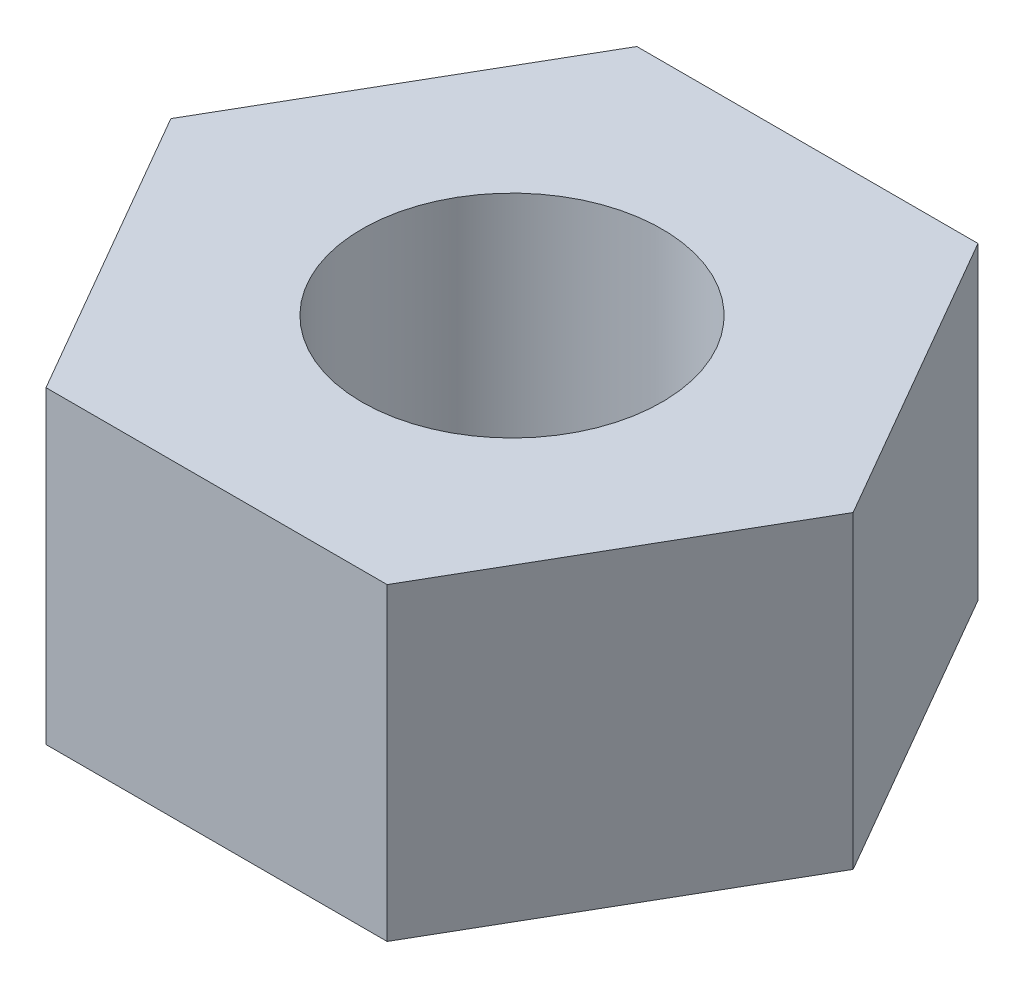
ISO-10303-21;
HEADER;
FILE_DESCRIPTION(('STEP AP214'),'2;1');
FILE_NAME('part.step','',(''),(''),'','','');
FILE_SCHEMA(('AUTOMOTIVE_DESIGN { 1 0 10303 214 1 1 1 1 }'));
ENDSEC;
DATA;
#1=APPLICATION_CONTEXT('core data for automotive mechanical design processes');
#2=APPLICATION_PROTOCOL_DEFINITION('international standard','automotive_design',2000,#1);
#3=PRODUCT_CONTEXT('',#1,'mechanical');
#4=PRODUCT('Part','Part','',(#3));
#5=PRODUCT_RELATED_PRODUCT_CATEGORY('part','',(#4));
#6=PRODUCT_DEFINITION_FORMATION('','',#4);
#7=PRODUCT_DEFINITION_CONTEXT('part definition',#1,'design');
#8=PRODUCT_DEFINITION('design','',#6,#7);
#9=PRODUCT_DEFINITION_SHAPE('','',#8);
#10=(LENGTH_UNIT() NAMED_UNIT(*) SI_UNIT(.MILLI.,.METRE.));
#11=(NAMED_UNIT(*) PLANE_ANGLE_UNIT() SI_UNIT($,.RADIAN.));
#12=(NAMED_UNIT(*) SI_UNIT($,.STERADIAN.) SOLID_ANGLE_UNIT());
#13=UNCERTAINTY_MEASURE_WITH_UNIT(LENGTH_MEASURE(1.E-05),#10,'distance_accuracy_value','');
#14=(GEOMETRIC_REPRESENTATION_CONTEXT(3) GLOBAL_UNCERTAINTY_ASSIGNED_CONTEXT((#13)) GLOBAL_UNIT_ASSIGNED_CONTEXT((#10,
#11,#12)) REPRESENTATION_CONTEXT('',''));
#15=CARTESIAN_POINT('',(0.,0.,0.));
#16=DIRECTION('',(0.,0.,1.));
#17=DIRECTION('',(1.,0.,0.));
#18=AXIS2_PLACEMENT_3D('',#15,#16,#17);
#19=CARTESIAN_POINT('',(3.76277674973258,-0.01,-6.5));
#20=DIRECTION('',(0.,0.,-1.));
#21=DIRECTION('',(-1.,0.,0.));
#22=AXIS2_PLACEMENT_3D('',#19,#20,#21);
#23=PLANE('',#22);
#24=DIRECTION('',(-1.,0.,0.));
#25=VECTOR('',#24,1.);
#26=CARTESIAN_POINT('',(0.,6.8,-6.5));
#27=LINE('',#26,#25);
#28=CARTESIAN_POINT('',(3.75277674973258,6.8,-6.5));
#29=VERTEX_POINT('',#28);
#30=CARTESIAN_POINT('',(-3.75277674973257,6.8,-6.5));
#31=VERTEX_POINT('',#30);
#32=EDGE_CURVE('E89',#29,#31,#27,.T.);
#33=ORIENTED_EDGE('',*,*,#32,.F.);
#34=DIRECTION('',(0.,1.,0.));
#35=VECTOR('',#34,1.);
#36=CARTESIAN_POINT('',(3.75277674973258,3.4,-6.5));
#37=LINE('',#36,#35);
#38=CARTESIAN_POINT('',(3.75277674973258,0.,-6.5));
#39=VERTEX_POINT('',#38);
#40=EDGE_CURVE('E96',#39,#29,#37,.T.);
#41=ORIENTED_EDGE('',*,*,#40,.F.);
#42=DIRECTION('',(1.,0.,0.));
#43=VECTOR('',#42,1.);
#44=CARTESIAN_POINT('',(0.,0.,-6.5));
#45=LINE('',#44,#43);
#46=CARTESIAN_POINT('',(-3.75277674973257,0.,-6.5));
#47=VERTEX_POINT('',#46);
#48=EDGE_CURVE('E106',#47,#39,#45,.T.);
#49=ORIENTED_EDGE('',*,*,#48,.F.);
#50=DIRECTION('',(0.,-1.,0.));
#51=VECTOR('',#50,1.);
#52=CARTESIAN_POINT('',(-3.75277674973257,3.4,-6.5));
#53=LINE('',#52,#51);
#54=EDGE_CURVE('E68',#31,#47,#53,.T.);
#55=ORIENTED_EDGE('',*,*,#54,.F.);
#56=EDGE_LOOP('',(#33,#41,#49,#55));
#57=FACE_BOUND('',#56,.T.);
#58=ADVANCED_FACE('F17',(#57),#23,.T.);
#59=CARTESIAN_POINT('',(7.51055349946513,-0.01,0.00866025403785105));
#60=DIRECTION('',(0.86602540378444,0.,-0.499999999999998));
#61=DIRECTION('',(-0.499999999999998,0.,-0.86602540378444));
#62=AXIS2_PLACEMENT_3D('',#59,#60,#61);
#63=PLANE('',#62);
#64=DIRECTION('',(-0.499999999999998,0.,-0.86602540378444));
#65=VECTOR('',#64,1.);
#66=CARTESIAN_POINT('',(7.50555349946513,6.8,0.));
#67=LINE('',#66,#65);
#68=CARTESIAN_POINT('',(7.50555349946514,6.8,0.));
#69=VERTEX_POINT('',#68);
#70=EDGE_CURVE('E109',#69,#29,#67,.T.);
#71=ORIENTED_EDGE('',*,*,#70,.F.);
#72=DIRECTION('',(0.,1.,0.));
#73=VECTOR('',#72,1.);
#74=CARTESIAN_POINT('',(7.50555349946514,3.4,0.));
#75=LINE('',#74,#73);
#76=CARTESIAN_POINT('',(7.50555349946514,0.,0.));
#77=VERTEX_POINT('',#76);
#78=EDGE_CURVE('E94',#77,#69,#75,.T.);
#79=ORIENTED_EDGE('',*,*,#78,.F.);
#80=DIRECTION('',(0.499999999999998,0.,0.86602540378444));
#81=VECTOR('',#80,1.);
#82=CARTESIAN_POINT('',(3.75277674973258,0.,-6.5));
#83=LINE('',#82,#81);
#84=EDGE_CURVE('E108',#39,#77,#83,.T.);
#85=ORIENTED_EDGE('',*,*,#84,.F.);
#86=ORIENTED_EDGE('',*,*,#40,.T.);
#87=EDGE_LOOP('',(#71,#79,#85,#86));
#88=FACE_BOUND('',#87,.T.);
#89=ADVANCED_FACE('F131',(#88),#63,.T.);
#90=CARTESIAN_POINT('',(3.74777674973257,-0.01,6.50866025403785));
#91=DIRECTION('',(0.866025403784438,0.,0.5));
#92=DIRECTION('',(0.5,0.,-0.866025403784438));
#93=AXIS2_PLACEMENT_3D('',#90,#91,#92);
#94=PLANE('',#93);
#95=DIRECTION('',(0.5,0.,-0.866025403784438));
#96=VECTOR('',#95,1.);
#97=CARTESIAN_POINT('',(3.75277674973257,6.8,6.5));
#98=LINE('',#97,#96);
#99=CARTESIAN_POINT('',(3.75277674973257,6.8,6.5));
#100=VERTEX_POINT('',#99);
#101=EDGE_CURVE('E120',#100,#69,#98,.T.);
#102=ORIENTED_EDGE('',*,*,#101,.F.);
#103=DIRECTION('',(0.,1.,0.));
#104=VECTOR('',#103,1.);
#105=CARTESIAN_POINT('',(3.75277674973257,3.4,6.5));
#106=LINE('',#105,#104);
#107=CARTESIAN_POINT('',(3.75277674973257,0.,6.5));
#108=VERTEX_POINT('',#107);
#109=EDGE_CURVE('E100',#108,#100,#106,.T.);
#110=ORIENTED_EDGE('',*,*,#109,.F.);
#111=DIRECTION('',(-0.500000000000001,0.,0.866025403784438));
#112=VECTOR('',#111,1.);
#113=CARTESIAN_POINT('',(7.50555349946514,0.,0.));
#114=LINE('',#113,#112);
#115=EDGE_CURVE('E105',#77,#108,#114,.T.);
#116=ORIENTED_EDGE('',*,*,#115,.F.);
#117=ORIENTED_EDGE('',*,*,#78,.T.);
#118=EDGE_LOOP('',(#102,#110,#116,#117));
#119=FACE_BOUND('',#118,.T.);
#120=ADVANCED_FACE('F128',(#119),#94,.T.);
#121=CARTESIAN_POINT('',(-3.76277674973257,-0.01,6.5));
#122=DIRECTION('',(0.,0.,1.));
#123=DIRECTION('',(1.,0.,0.));
#124=AXIS2_PLACEMENT_3D('',#121,#122,#123);
#125=PLANE('',#124);
#126=DIRECTION('',(1.,0.,0.));
#127=VECTOR('',#126,1.);
#128=CARTESIAN_POINT('',(0.,6.8,6.5));
#129=LINE('',#128,#127);
#130=CARTESIAN_POINT('',(-3.75277674973257,6.8,6.5));
#131=VERTEX_POINT('',#130);
#132=EDGE_CURVE('E85',#131,#100,#129,.T.);
#133=ORIENTED_EDGE('',*,*,#132,.F.);
#134=DIRECTION('',(0.,1.,0.));
#135=VECTOR('',#134,1.);
#136=CARTESIAN_POINT('',(-3.75277674973257,3.4,6.5));
#137=LINE('',#136,#135);
#138=CARTESIAN_POINT('',(-3.75277674973257,0.,6.5));
#139=VERTEX_POINT('',#138);
#140=EDGE_CURVE('E77',#139,#131,#137,.T.);
#141=ORIENTED_EDGE('',*,*,#140,.F.);
#142=DIRECTION('',(-1.,0.,0.));
#143=VECTOR('',#142,1.);
#144=CARTESIAN_POINT('',(0.,0.,6.5));
#145=LINE('',#144,#143);
#146=EDGE_CURVE('E101',#108,#139,#145,.T.);
#147=ORIENTED_EDGE('',*,*,#146,.F.);
#148=ORIENTED_EDGE('',*,*,#109,.T.);
#149=EDGE_LOOP('',(#133,#141,#147,#148));
#150=FACE_BOUND('',#149,.T.);
#151=ADVANCED_FACE('F134',(#150),#125,.T.);
#152=CARTESIAN_POINT('',(-7.51055349946513,-0.01,-0.00866025403782997));
#153=DIRECTION('',(-0.866025403784438,0.,0.5));
#154=DIRECTION('',(0.5,0.,0.866025403784438));
#155=AXIS2_PLACEMENT_3D('',#152,#153,#154);
#156=PLANE('',#155);
#157=DIRECTION('',(0.5,0.,0.866025403784438));
#158=VECTOR('',#157,1.);
#159=CARTESIAN_POINT('',(-7.50555349946513,6.8,0.));
#160=LINE('',#159,#158);
#161=CARTESIAN_POINT('',(-7.50555349946513,6.8,0.));
#162=VERTEX_POINT('',#161);
#163=EDGE_CURVE('E80',#162,#131,#160,.T.);
#164=ORIENTED_EDGE('',*,*,#163,.F.);
#165=DIRECTION('',(0.,1.,0.));
#166=VECTOR('',#165,1.);
#167=CARTESIAN_POINT('',(-7.50555349946513,3.4,0.));
#168=LINE('',#167,#166);
#169=CARTESIAN_POINT('',(-7.50555349946513,0.,0.));
#170=VERTEX_POINT('',#169);
#171=EDGE_CURVE('E36',#170,#162,#168,.T.);
#172=ORIENTED_EDGE('',*,*,#171,.F.);
#173=DIRECTION('',(-0.5,0.,-0.866025403784438));
#174=VECTOR('',#173,1.);
#175=CARTESIAN_POINT('',(-3.75277674973257,0.,6.5));
#176=LINE('',#175,#174);
#177=EDGE_CURVE('E104',#139,#170,#176,.T.);
#178=ORIENTED_EDGE('',*,*,#177,.F.);
#179=ORIENTED_EDGE('',*,*,#140,.T.);
#180=EDGE_LOOP('',(#164,#172,#178,#179));
#181=FACE_BOUND('',#180,.T.);
#182=ADVANCED_FACE('F81',(#181),#156,.T.);
#183=CARTESIAN_POINT('',(-3.74777674973257,-0.01,-6.50866025403785));
#184=DIRECTION('',(-0.86602540378444,0.,-0.499999999999998));
#185=DIRECTION('',(-0.499999999999998,0.,0.86602540378444));
#186=AXIS2_PLACEMENT_3D('',#183,#184,#185);
#187=PLANE('',#186);
#188=DIRECTION('',(-0.499999999999998,0.,0.866025403784439));
#189=VECTOR('',#188,1.);
#190=CARTESIAN_POINT('',(-3.75277674973257,6.8,-6.5));
#191=LINE('',#190,#189);
#192=EDGE_CURVE('E21',#31,#162,#191,.T.);
#193=ORIENTED_EDGE('',*,*,#192,.F.);
#194=ORIENTED_EDGE('',*,*,#54,.T.);
#195=DIRECTION('',(0.499999999999999,0.,-0.866025403784439));
#196=VECTOR('',#195,1.);
#197=CARTESIAN_POINT('',(-7.50555349946513,0.,0.));
#198=LINE('',#197,#196);
#199=EDGE_CURVE('E75',#170,#47,#198,.T.);
#200=ORIENTED_EDGE('',*,*,#199,.F.);
#201=ORIENTED_EDGE('',*,*,#171,.T.);
#202=EDGE_LOOP('',(#193,#194,#200,#201));
#203=FACE_BOUND('',#202,.T.);
#204=ADVANCED_FACE('F71',(#203),#187,.T.);
#205=CARTESIAN_POINT('',(-7.51555349946513,6.8,6.51));
#206=DIRECTION('',(0.,1.,0.));
#207=DIRECTION('',(1.,0.,0.));
#208=AXIS2_PLACEMENT_3D('',#205,#206,#207);
#209=PLANE('',#208);
#210=CARTESIAN_POINT('',(0.,6.8,0.));
#211=DIRECTION('',(0.,1.,0.));
#212=DIRECTION('',(0.,0.,1.));
#213=AXIS2_PLACEMENT_3D('',#210,#211,#212);
#214=CIRCLE('',#213,3.3);
#215=CARTESIAN_POINT('',(0.,6.8,3.3));
#216=VERTEX_POINT('',#215);
#217=EDGE_CURVE('E27',#216,#216,#214,.T.);
#218=ORIENTED_EDGE('',*,*,#217,.F.);
#219=EDGE_LOOP('',(#218));
#220=FACE_BOUND('',#219,.T.);
#221=ORIENTED_EDGE('',*,*,#101,.T.);
#222=ORIENTED_EDGE('',*,*,#70,.T.);
#223=ORIENTED_EDGE('',*,*,#32,.T.);
#224=ORIENTED_EDGE('',*,*,#192,.T.);
#225=ORIENTED_EDGE('',*,*,#163,.T.);
#226=ORIENTED_EDGE('',*,*,#132,.T.);
#227=EDGE_LOOP('',(#221,#222,#223,#224,#225,#226));
#228=FACE_BOUND('',#227,.T.);
#229=ADVANCED_FACE('F87',(#220,#228),#209,.T.);
#230=CARTESIAN_POINT('',(7.51555349946514,0.,6.51));
#231=DIRECTION('',(0.,-1.,0.));
#232=DIRECTION('',(-1.,0.,0.));
#233=AXIS2_PLACEMENT_3D('',#230,#231,#232);
#234=PLANE('',#233);
#235=CARTESIAN_POINT('',(0.,0.,0.));
#236=DIRECTION('',(0.,1.,0.));
#237=DIRECTION('',(0.,0.,1.));
#238=AXIS2_PLACEMENT_3D('',#235,#236,#237);
#239=CIRCLE('',#238,3.3);
#240=CARTESIAN_POINT('',(0.,0.,3.3));
#241=VERTEX_POINT('',#240);
#242=EDGE_CURVE('E11',#241,#241,#239,.F.);
#243=ORIENTED_EDGE('',*,*,#242,.F.);
#244=EDGE_LOOP('',(#243));
#245=FACE_BOUND('',#244,.T.);
#246=ORIENTED_EDGE('',*,*,#177,.T.);
#247=ORIENTED_EDGE('',*,*,#199,.T.);
#248=ORIENTED_EDGE('',*,*,#48,.T.);
#249=ORIENTED_EDGE('',*,*,#84,.T.);
#250=ORIENTED_EDGE('',*,*,#115,.T.);
#251=ORIENTED_EDGE('',*,*,#146,.T.);
#252=EDGE_LOOP('',(#246,#247,#248,#249,#250,#251));
#253=FACE_BOUND('',#252,.T.);
#254=ADVANCED_FACE('F133',(#245,#253),#234,.T.);
#255=CARTESIAN_POINT('',(0.,0.,0.));
#256=DIRECTION('',(0.,1.,0.));
#257=DIRECTION('',(0.,0.,1.));
#258=AXIS2_PLACEMENT_3D('',#255,#256,#257);
#259=CYLINDRICAL_SURFACE('',#258,3.3);
#260=ORIENTED_EDGE('',*,*,#242,.T.);
#261=EDGE_LOOP('',(#260));
#262=FACE_BOUND('',#261,.T.);
#263=ORIENTED_EDGE('',*,*,#217,.T.);
#264=EDGE_LOOP('',(#263));
#265=FACE_BOUND('',#264,.T.);
#266=ADVANCED_FACE('F19',(#262,#265),#259,.F.);
#267=CLOSED_SHELL('',(#58,#89,#120,#151,#182,#204,#229,#254,#266));
#268=MANIFOLD_SOLID_BREP('B1',#267);
#269=ADVANCED_BREP_SHAPE_REPRESENTATION('',(#18,#268),#14);
#270=SHAPE_DEFINITION_REPRESENTATION(#9,#269);
ENDSEC;
END-ISO-10303-21;
